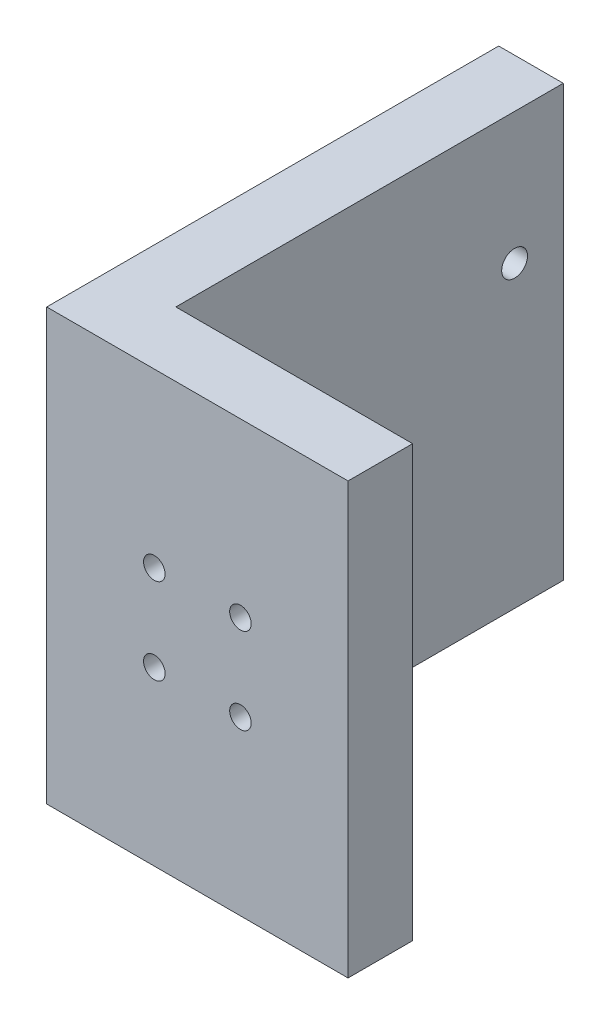
ISO-10303-21;
HEADER;
FILE_DESCRIPTION(('STEP AP214'),'2;1');
FILE_NAME('part.step','',(''),(''),'','','');
FILE_SCHEMA(('AUTOMOTIVE_DESIGN { 1 0 10303 214 1 1 1 1 }'));
ENDSEC;
DATA;
#1=APPLICATION_CONTEXT('core data for automotive mechanical design processes');
#2=APPLICATION_PROTOCOL_DEFINITION('international standard','automotive_design',2000,#1);
#3=PRODUCT_CONTEXT('',#1,'mechanical');
#4=PRODUCT('Part','Part','',(#3));
#5=PRODUCT_RELATED_PRODUCT_CATEGORY('part','',(#4));
#6=PRODUCT_DEFINITION_FORMATION('','',#4);
#7=PRODUCT_DEFINITION_CONTEXT('part definition',#1,'design');
#8=PRODUCT_DEFINITION('design','',#6,#7);
#9=PRODUCT_DEFINITION_SHAPE('','',#8);
#10=(LENGTH_UNIT() NAMED_UNIT(*) SI_UNIT(.MILLI.,.METRE.));
#11=(NAMED_UNIT(*) PLANE_ANGLE_UNIT() SI_UNIT($,.RADIAN.));
#12=(NAMED_UNIT(*) SI_UNIT($,.STERADIAN.) SOLID_ANGLE_UNIT());
#13=UNCERTAINTY_MEASURE_WITH_UNIT(LENGTH_MEASURE(1.E-05),#10,'distance_accuracy_value','');
#14=(GEOMETRIC_REPRESENTATION_CONTEXT(3) GLOBAL_UNCERTAINTY_ASSIGNED_CONTEXT((#13)) GLOBAL_UNIT_ASSIGNED_CONTEXT((#10,
#11,#12)) REPRESENTATION_CONTEXT('',''));
#15=CARTESIAN_POINT('',(0.,0.,0.));
#16=DIRECTION('',(0.,0.,1.));
#17=DIRECTION('',(1.,0.,0.));
#18=AXIS2_PLACEMENT_3D('',#15,#16,#17);
#19=CARTESIAN_POINT('',(0.,50.,0.));
#20=DIRECTION('',(0.,0.,-1.));
#21=DIRECTION('',(-1.,0.,0.));
#22=AXIS2_PLACEMENT_3D('',#19,#20,#21);
#23=PLANE('',#22);
#24=CARTESIAN_POINT('',(12.5,30.,0.));
#25=DIRECTION('',(0.,0.,1.));
#26=DIRECTION('',(1.,0.,0.));
#27=AXIS2_PLACEMENT_3D('',#24,#25,#26);
#28=CIRCLE('',#27,1.25);
#29=CARTESIAN_POINT('',(13.75,30.,0.));
#30=VERTEX_POINT('',#29);
#31=EDGE_CURVE('E147',#30,#30,#28,.T.);
#32=ORIENTED_EDGE('',*,*,#31,.F.);
#33=EDGE_LOOP('',(#32));
#34=FACE_BOUND('',#33,.T.);
#35=CARTESIAN_POINT('',(12.5,20.,0.));
#36=DIRECTION('',(0.,0.,1.));
#37=DIRECTION('',(1.,0.,0.));
#38=AXIS2_PLACEMENT_3D('',#35,#36,#37);
#39=CIRCLE('',#38,1.25);
#40=CARTESIAN_POINT('',(13.75,20.,0.));
#41=VERTEX_POINT('',#40);
#42=EDGE_CURVE('E143',#41,#41,#39,.T.);
#43=ORIENTED_EDGE('',*,*,#42,.F.);
#44=EDGE_LOOP('',(#43));
#45=FACE_BOUND('',#44,.T.);
#46=CARTESIAN_POINT('',(22.5,20.,0.));
#47=DIRECTION('',(0.,0.,1.));
#48=DIRECTION('',(1.,0.,0.));
#49=AXIS2_PLACEMENT_3D('',#46,#47,#48);
#50=CIRCLE('',#49,1.25);
#51=CARTESIAN_POINT('',(23.75,20.,0.));
#52=VERTEX_POINT('',#51);
#53=EDGE_CURVE('E140',#52,#52,#50,.T.);
#54=ORIENTED_EDGE('',*,*,#53,.F.);
#55=EDGE_LOOP('',(#54));
#56=FACE_BOUND('',#55,.T.);
#57=CARTESIAN_POINT('',(22.5,30.,0.));
#58=DIRECTION('',(0.,0.,1.));
#59=DIRECTION('',(1.,0.,0.));
#60=AXIS2_PLACEMENT_3D('',#57,#58,#59);
#61=CIRCLE('',#60,1.25);
#62=CARTESIAN_POINT('',(23.75,30.,0.));
#63=VERTEX_POINT('',#62);
#64=EDGE_CURVE('E113',#63,#63,#61,.T.);
#65=ORIENTED_EDGE('',*,*,#64,.F.);
#66=EDGE_LOOP('',(#65));
#67=FACE_BOUND('',#66,.T.);
#68=DIRECTION('',(1.,0.,0.));
#69=VECTOR('',#68,1.);
#70=CARTESIAN_POINT('',(0.,0.,0.));
#71=LINE('',#70,#69);
#72=CARTESIAN_POINT('',(0.,0.,0.));
#73=VERTEX_POINT('',#72);
#74=CARTESIAN_POINT('',(35.,0.,0.));
#75=VERTEX_POINT('',#74);
#76=EDGE_CURVE('E85',#73,#75,#71,.T.);
#77=ORIENTED_EDGE('',*,*,#76,.T.);
#78=DIRECTION('',(0.,-1.,0.));
#79=VECTOR('',#78,1.);
#80=CARTESIAN_POINT('',(35.,50.,0.));
#81=LINE('',#80,#79);
#82=CARTESIAN_POINT('',(35.,50.,0.));
#83=VERTEX_POINT('',#82);
#84=EDGE_CURVE('E45',#83,#75,#81,.T.);
#85=ORIENTED_EDGE('',*,*,#84,.F.);
#86=DIRECTION('',(1.,0.,0.));
#87=VECTOR('',#86,1.);
#88=CARTESIAN_POINT('',(0.,50.,0.));
#89=LINE('',#88,#87);
#90=CARTESIAN_POINT('',(0.,50.,0.));
#91=VERTEX_POINT('',#90);
#92=EDGE_CURVE('E88',#91,#83,#89,.T.);
#93=ORIENTED_EDGE('',*,*,#92,.F.);
#94=DIRECTION('',(0.,-1.,0.));
#95=VECTOR('',#94,1.);
#96=CARTESIAN_POINT('',(0.,50.,0.));
#97=LINE('',#96,#95);
#98=EDGE_CURVE('E157',#91,#73,#97,.T.);
#99=ORIENTED_EDGE('',*,*,#98,.T.);
#100=EDGE_LOOP('',(#77,#85,#93,#99));
#101=FACE_BOUND('',#100,.T.);
#102=ADVANCED_FACE('F35',(#34,#45,#56,#67,#101),#23,.F.);
#103=CARTESIAN_POINT('',(35.,50.,0.));
#104=DIRECTION('',(-1.,0.,0.));
#105=DIRECTION('',(0.,0.,1.));
#106=AXIS2_PLACEMENT_3D('',#103,#104,#105);
#107=PLANE('',#106);
#108=DIRECTION('',(0.,0.,-1.));
#109=VECTOR('',#108,1.);
#110=CARTESIAN_POINT('',(35.,0.,0.));
#111=LINE('',#110,#109);
#112=CARTESIAN_POINT('',(35.,0.,-7.5));
#113=VERTEX_POINT('',#112);
#114=EDGE_CURVE('E159',#75,#113,#111,.T.);
#115=ORIENTED_EDGE('',*,*,#114,.T.);
#116=DIRECTION('',(0.,-1.,0.));
#117=VECTOR('',#116,1.);
#118=CARTESIAN_POINT('',(35.,50.,-7.5));
#119=LINE('',#118,#117);
#120=CARTESIAN_POINT('',(35.,50.,-7.5));
#121=VERTEX_POINT('',#120);
#122=EDGE_CURVE('E166',#121,#113,#119,.T.);
#123=ORIENTED_EDGE('',*,*,#122,.F.);
#124=DIRECTION('',(0.,0.,-1.));
#125=VECTOR('',#124,1.);
#126=CARTESIAN_POINT('',(35.,50.,0.));
#127=LINE('',#126,#125);
#128=EDGE_CURVE('E151',#83,#121,#127,.T.);
#129=ORIENTED_EDGE('',*,*,#128,.F.);
#130=ORIENTED_EDGE('',*,*,#84,.T.);
#131=EDGE_LOOP('',(#115,#123,#129,#130));
#132=FACE_BOUND('',#131,.T.);
#133=ADVANCED_FACE('F124',(#132),#107,.F.);
#134=CARTESIAN_POINT('',(0.,50.,-7.5));
#135=DIRECTION('',(0.,0.,-1.));
#136=DIRECTION('',(-1.,0.,0.));
#137=AXIS2_PLACEMENT_3D('',#134,#135,#136);
#138=PLANE('',#137);
#139=CARTESIAN_POINT('',(12.5,30.,-7.5));
#140=DIRECTION('',(0.,0.,-1.));
#141=DIRECTION('',(-1.,0.,0.));
#142=AXIS2_PLACEMENT_3D('',#139,#140,#141);
#143=CIRCLE('',#142,1.25);
#144=CARTESIAN_POINT('',(11.25,30.,-7.5));
#145=VERTEX_POINT('',#144);
#146=EDGE_CURVE('E39',#145,#145,#143,.T.);
#147=ORIENTED_EDGE('',*,*,#146,.F.);
#148=EDGE_LOOP('',(#147));
#149=FACE_BOUND('',#148,.T.);
#150=CARTESIAN_POINT('',(12.5,20.,-7.5));
#151=DIRECTION('',(0.,0.,-1.));
#152=DIRECTION('',(-1.,0.,0.));
#153=AXIS2_PLACEMENT_3D('',#150,#151,#152);
#154=CIRCLE('',#153,1.25);
#155=CARTESIAN_POINT('',(11.25,20.,-7.5));
#156=VERTEX_POINT('',#155);
#157=EDGE_CURVE('E103',#156,#156,#154,.T.);
#158=ORIENTED_EDGE('',*,*,#157,.F.);
#159=EDGE_LOOP('',(#158));
#160=FACE_BOUND('',#159,.T.);
#161=CARTESIAN_POINT('',(22.5,20.,-7.5));
#162=DIRECTION('',(0.,0.,-1.));
#163=DIRECTION('',(-1.,0.,0.));
#164=AXIS2_PLACEMENT_3D('',#161,#162,#163);
#165=CIRCLE('',#164,1.25);
#166=CARTESIAN_POINT('',(21.25,20.,-7.5));
#167=VERTEX_POINT('',#166);
#168=EDGE_CURVE('E112',#167,#167,#165,.T.);
#169=ORIENTED_EDGE('',*,*,#168,.F.);
#170=EDGE_LOOP('',(#169));
#171=FACE_BOUND('',#170,.T.);
#172=CARTESIAN_POINT('',(22.5,30.,-7.5));
#173=DIRECTION('',(0.,0.,-1.));
#174=DIRECTION('',(-1.,0.,0.));
#175=AXIS2_PLACEMENT_3D('',#172,#173,#174);
#176=CIRCLE('',#175,1.25);
#177=CARTESIAN_POINT('',(21.25,30.,-7.5));
#178=VERTEX_POINT('',#177);
#179=EDGE_CURVE('E109',#178,#178,#176,.T.);
#180=ORIENTED_EDGE('',*,*,#179,.F.);
#181=EDGE_LOOP('',(#180));
#182=FACE_BOUND('',#181,.T.);
#183=DIRECTION('',(0.,-1.,0.));
#184=VECTOR('',#183,1.);
#185=CARTESIAN_POINT('',(7.5,50.,-7.5));
#186=LINE('',#185,#184);
#187=CARTESIAN_POINT('',(7.5,50.,-7.5));
#188=VERTEX_POINT('',#187);
#189=CARTESIAN_POINT('',(7.5,0.,-7.5));
#190=VERTEX_POINT('',#189);
#191=EDGE_CURVE('E11',#188,#190,#186,.T.);
#192=ORIENTED_EDGE('',*,*,#191,.F.);
#193=DIRECTION('',(1.,0.,0.));
#194=VECTOR('',#193,1.);
#195=CARTESIAN_POINT('',(0.,50.,-7.5));
#196=LINE('',#195,#194);
#197=EDGE_CURVE('E154',#188,#121,#196,.T.);
#198=ORIENTED_EDGE('',*,*,#197,.T.);
#199=ORIENTED_EDGE('',*,*,#122,.T.);
#200=DIRECTION('',(1.,0.,0.));
#201=VECTOR('',#200,1.);
#202=CARTESIAN_POINT('',(0.,0.,-7.5));
#203=LINE('',#202,#201);
#204=EDGE_CURVE('E89',#190,#113,#203,.T.);
#205=ORIENTED_EDGE('',*,*,#204,.F.);
#206=EDGE_LOOP('',(#192,#198,#199,#205));
#207=FACE_BOUND('',#206,.T.);
#208=ADVANCED_FACE('F121',(#149,#160,#171,#182,#207),#138,.T.);
#209=CARTESIAN_POINT('',(0.,50.,0.));
#210=DIRECTION('',(-1.,0.,0.));
#211=DIRECTION('',(0.,0.,1.));
#212=AXIS2_PLACEMENT_3D('',#209,#210,#211);
#213=PLANE('',#212);
#214=CARTESIAN_POINT('',(0.,5.55,-30.));
#215=DIRECTION('',(-1.,0.,0.));
#216=DIRECTION('',(0.,0.,1.));
#217=AXIS2_PLACEMENT_3D('',#214,#215,#216);
#218=CIRCLE('',#217,1.5);
#219=CARTESIAN_POINT('',(0.,5.55,-28.5));
#220=VERTEX_POINT('',#219);
#221=EDGE_CURVE('E216',#220,#220,#218,.F.);
#222=ORIENTED_EDGE('',*,*,#221,.T.);
#223=EDGE_LOOP('',(#222));
#224=FACE_BOUND('',#223,.T.);
#225=CARTESIAN_POINT('',(0.,34.725,-46.8441941036074));
#226=DIRECTION('',(-1.,0.,0.));
#227=DIRECTION('',(0.,0.,1.));
#228=AXIS2_PLACEMENT_3D('',#225,#226,#227);
#229=CIRCLE('',#228,1.50000000000001);
#230=CARTESIAN_POINT('',(0.,34.725,-45.3441941036074));
#231=VERTEX_POINT('',#230);
#232=EDGE_CURVE('E220',#231,#231,#229,.F.);
#233=ORIENTED_EDGE('',*,*,#232,.T.);
#234=EDGE_LOOP('',(#233));
#235=FACE_BOUND('',#234,.T.);
#236=CARTESIAN_POINT('',(0.,34.7250000000001,-13.1558058963927));
#237=DIRECTION('',(-1.,0.,0.));
#238=DIRECTION('',(0.,0.,1.));
#239=AXIS2_PLACEMENT_3D('',#236,#237,#238);
#240=CIRCLE('',#239,1.5);
#241=CARTESIAN_POINT('',(0.,34.7250000000001,-11.6558058963927));
#242=VERTEX_POINT('',#241);
#243=EDGE_CURVE('E223',#242,#242,#240,.F.);
#244=ORIENTED_EDGE('',*,*,#243,.T.);
#245=EDGE_LOOP('',(#244));
#246=FACE_BOUND('',#245,.T.);
#247=DIRECTION('',(0.,0.,-1.));
#248=VECTOR('',#247,1.);
#249=CARTESIAN_POINT('',(0.,0.,0.));
#250=LINE('',#249,#248);
#251=CARTESIAN_POINT('',(0.,0.,-52.5));
#252=VERTEX_POINT('',#251);
#253=EDGE_CURVE('E77',#73,#252,#250,.T.);
#254=ORIENTED_EDGE('',*,*,#253,.F.);
#255=ORIENTED_EDGE('',*,*,#98,.F.);
#256=DIRECTION('',(0.,0.,-1.));
#257=VECTOR('',#256,1.);
#258=CARTESIAN_POINT('',(0.,50.,0.));
#259=LINE('',#258,#257);
#260=CARTESIAN_POINT('',(0.,50.,-52.5));
#261=VERTEX_POINT('',#260);
#262=EDGE_CURVE('E95',#91,#261,#259,.T.);
#263=ORIENTED_EDGE('',*,*,#262,.T.);
#264=DIRECTION('',(0.,-1.,0.));
#265=VECTOR('',#264,1.);
#266=CARTESIAN_POINT('',(0.,50.,-52.5));
#267=LINE('',#266,#265);
#268=EDGE_CURVE('E92',#261,#252,#267,.T.);
#269=ORIENTED_EDGE('',*,*,#268,.T.);
#270=EDGE_LOOP('',(#254,#255,#263,#269));
#271=FACE_BOUND('',#270,.T.);
#272=ADVANCED_FACE('F93',(#224,#235,#246,#271),#213,.T.);
#273=CARTESIAN_POINT('',(0.,50.,0.));
#274=DIRECTION('',(0.,1.,0.));
#275=DIRECTION('',(0.,0.,1.));
#276=AXIS2_PLACEMENT_3D('',#273,#274,#275);
#277=PLANE('',#276);
#278=ORIENTED_EDGE('',*,*,#92,.T.);
#279=ORIENTED_EDGE('',*,*,#128,.T.);
#280=ORIENTED_EDGE('',*,*,#197,.F.);
#281=DIRECTION('',(0.,0.,-1.));
#282=VECTOR('',#281,1.);
#283=CARTESIAN_POINT('',(7.5,50.,-7.5));
#284=LINE('',#283,#282);
#285=CARTESIAN_POINT('',(7.5,50.,-52.5));
#286=VERTEX_POINT('',#285);
#287=EDGE_CURVE('E105',#188,#286,#284,.T.);
#288=ORIENTED_EDGE('',*,*,#287,.T.);
#289=DIRECTION('',(1.,0.,0.));
#290=VECTOR('',#289,1.);
#291=CARTESIAN_POINT('',(0.,50.,-52.5));
#292=LINE('',#291,#290);
#293=EDGE_CURVE('E100',#261,#286,#292,.T.);
#294=ORIENTED_EDGE('',*,*,#293,.F.);
#295=ORIENTED_EDGE('',*,*,#262,.F.);
#296=EDGE_LOOP('',(#278,#279,#280,#288,#294,#295));
#297=FACE_BOUND('',#296,.T.);
#298=ADVANCED_FACE('F172',(#297),#277,.T.);
#299=CARTESIAN_POINT('',(0.,0.,0.));
#300=DIRECTION('',(0.,1.,0.));
#301=DIRECTION('',(0.,0.,1.));
#302=AXIS2_PLACEMENT_3D('',#299,#300,#301);
#303=PLANE('',#302);
#304=ORIENTED_EDGE('',*,*,#76,.F.);
#305=ORIENTED_EDGE('',*,*,#253,.T.);
#306=DIRECTION('',(1.,0.,0.));
#307=VECTOR('',#306,1.);
#308=CARTESIAN_POINT('',(0.,0.,-52.5));
#309=LINE('',#308,#307);
#310=CARTESIAN_POINT('',(7.5,0.,-52.5));
#311=VERTEX_POINT('',#310);
#312=EDGE_CURVE('E81',#252,#311,#309,.T.);
#313=ORIENTED_EDGE('',*,*,#312,.T.);
#314=DIRECTION('',(0.,0.,-1.));
#315=VECTOR('',#314,1.);
#316=CARTESIAN_POINT('',(7.5,0.,-7.5));
#317=LINE('',#316,#315);
#318=EDGE_CURVE('E98',#190,#311,#317,.T.);
#319=ORIENTED_EDGE('',*,*,#318,.F.);
#320=ORIENTED_EDGE('',*,*,#204,.T.);
#321=ORIENTED_EDGE('',*,*,#114,.F.);
#322=EDGE_LOOP('',(#304,#305,#313,#319,#320,#321));
#323=FACE_BOUND('',#322,.T.);
#324=ADVANCED_FACE('F79',(#323),#303,.F.);
#325=CARTESIAN_POINT('',(0.,50.,-52.5));
#326=DIRECTION('',(0.,0.,-1.));
#327=DIRECTION('',(-1.,0.,0.));
#328=AXIS2_PLACEMENT_3D('',#325,#326,#327);
#329=PLANE('',#328);
#330=ORIENTED_EDGE('',*,*,#312,.F.);
#331=ORIENTED_EDGE('',*,*,#268,.F.);
#332=ORIENTED_EDGE('',*,*,#293,.T.);
#333=DIRECTION('',(0.,-1.,0.));
#334=VECTOR('',#333,1.);
#335=CARTESIAN_POINT('',(7.5,50.,-52.5));
#336=LINE('',#335,#334);
#337=EDGE_CURVE('E70',#286,#311,#336,.T.);
#338=ORIENTED_EDGE('',*,*,#337,.T.);
#339=EDGE_LOOP('',(#330,#331,#332,#338));
#340=FACE_BOUND('',#339,.T.);
#341=ADVANCED_FACE('F37',(#340),#329,.T.);
#342=CARTESIAN_POINT('',(7.5,50.,-7.5));
#343=DIRECTION('',(-1.,0.,0.));
#344=DIRECTION('',(0.,0.,1.));
#345=AXIS2_PLACEMENT_3D('',#342,#343,#344);
#346=PLANE('',#345);
#347=CARTESIAN_POINT('',(7.5,5.55,-30.));
#348=DIRECTION('',(1.,0.,0.));
#349=DIRECTION('',(0.,0.,-1.));
#350=AXIS2_PLACEMENT_3D('',#347,#348,#349);
#351=CIRCLE('',#350,1.5);
#352=CARTESIAN_POINT('',(7.5,5.55,-31.5));
#353=VERTEX_POINT('',#352);
#354=EDGE_CURVE('E225',#353,#353,#351,.F.);
#355=ORIENTED_EDGE('',*,*,#354,.T.);
#356=EDGE_LOOP('',(#355));
#357=FACE_BOUND('',#356,.T.);
#358=CARTESIAN_POINT('',(7.5,34.725,-46.8441941036074));
#359=DIRECTION('',(-1.,0.,0.));
#360=DIRECTION('',(0.,0.,1.));
#361=AXIS2_PLACEMENT_3D('',#358,#359,#360);
#362=CIRCLE('',#361,1.50000000000001);
#363=CARTESIAN_POINT('',(7.5,34.725,-45.3441941036074));
#364=VERTEX_POINT('',#363);
#365=EDGE_CURVE('E229',#364,#364,#362,.T.);
#366=ORIENTED_EDGE('',*,*,#365,.T.);
#367=EDGE_LOOP('',(#366));
#368=FACE_BOUND('',#367,.T.);
#369=CARTESIAN_POINT('',(7.5,34.7250000000001,-13.1558058963927));
#370=DIRECTION('',(-1.,0.,0.));
#371=DIRECTION('',(0.,0.,1.));
#372=AXIS2_PLACEMENT_3D('',#369,#370,#371);
#373=CIRCLE('',#372,1.5);
#374=CARTESIAN_POINT('',(7.5,34.7250000000001,-11.6558058963927));
#375=VERTEX_POINT('',#374);
#376=EDGE_CURVE('E232',#375,#375,#373,.T.);
#377=ORIENTED_EDGE('',*,*,#376,.T.);
#378=EDGE_LOOP('',(#377));
#379=FACE_BOUND('',#378,.T.);
#380=ORIENTED_EDGE('',*,*,#318,.T.);
#381=ORIENTED_EDGE('',*,*,#337,.F.);
#382=ORIENTED_EDGE('',*,*,#287,.F.);
#383=ORIENTED_EDGE('',*,*,#191,.T.);
#384=EDGE_LOOP('',(#380,#381,#382,#383));
#385=FACE_BOUND('',#384,.T.);
#386=ADVANCED_FACE('F135',(#357,#368,#379,#385),#346,.F.);
#387=CARTESIAN_POINT('',(22.5,30.,-37.5));
#388=DIRECTION('',(0.,0.,1.));
#389=DIRECTION('',(1.,0.,0.));
#390=AXIS2_PLACEMENT_3D('',#387,#388,#389);
#391=CYLINDRICAL_SURFACE('',#390,1.25);
#392=ORIENTED_EDGE('',*,*,#179,.T.);
#393=EDGE_LOOP('',(#392));
#394=FACE_BOUND('',#393,.T.);
#395=ORIENTED_EDGE('',*,*,#64,.T.);
#396=EDGE_LOOP('',(#395));
#397=FACE_BOUND('',#396,.T.);
#398=ADVANCED_FACE('F131',(#394,#397),#391,.F.);
#399=CARTESIAN_POINT('',(22.5,20.,-37.5));
#400=DIRECTION('',(0.,0.,1.));
#401=DIRECTION('',(1.,0.,0.));
#402=AXIS2_PLACEMENT_3D('',#399,#400,#401);
#403=CYLINDRICAL_SURFACE('',#402,1.25);
#404=ORIENTED_EDGE('',*,*,#168,.T.);
#405=EDGE_LOOP('',(#404));
#406=FACE_BOUND('',#405,.T.);
#407=ORIENTED_EDGE('',*,*,#53,.T.);
#408=EDGE_LOOP('',(#407));
#409=FACE_BOUND('',#408,.T.);
#410=ADVANCED_FACE('F134',(#406,#409),#403,.F.);
#411=CARTESIAN_POINT('',(12.5,20.,-37.5));
#412=DIRECTION('',(0.,0.,1.));
#413=DIRECTION('',(1.,0.,0.));
#414=AXIS2_PLACEMENT_3D('',#411,#412,#413);
#415=CYLINDRICAL_SURFACE('',#414,1.25);
#416=ORIENTED_EDGE('',*,*,#157,.T.);
#417=EDGE_LOOP('',(#416));
#418=FACE_BOUND('',#417,.T.);
#419=ORIENTED_EDGE('',*,*,#42,.T.);
#420=EDGE_LOOP('',(#419));
#421=FACE_BOUND('',#420,.T.);
#422=ADVANCED_FACE('F118',(#418,#421),#415,.F.);
#423=CARTESIAN_POINT('',(12.5,30.,-37.5));
#424=DIRECTION('',(0.,0.,1.));
#425=DIRECTION('',(1.,0.,0.));
#426=AXIS2_PLACEMENT_3D('',#423,#424,#425);
#427=CYLINDRICAL_SURFACE('',#426,1.25);
#428=ORIENTED_EDGE('',*,*,#146,.T.);
#429=EDGE_LOOP('',(#428));
#430=FACE_BOUND('',#429,.T.);
#431=ORIENTED_EDGE('',*,*,#31,.T.);
#432=EDGE_LOOP('',(#431));
#433=FACE_BOUND('',#432,.T.);
#434=ADVANCED_FACE('F239',(#430,#433),#427,.F.);
#435=CARTESIAN_POINT('',(-6.,34.7250000000001,-13.1558058963927));
#436=DIRECTION('',(1.,0.,0.));
#437=DIRECTION('',(0.,0.,-1.));
#438=AXIS2_PLACEMENT_3D('',#435,#436,#437);
#439=CYLINDRICAL_SURFACE('',#438,1.5);
#440=ORIENTED_EDGE('',*,*,#243,.F.);
#441=EDGE_LOOP('',(#440));
#442=FACE_BOUND('',#441,.T.);
#443=ORIENTED_EDGE('',*,*,#376,.F.);
#444=EDGE_LOOP('',(#443));
#445=FACE_BOUND('',#444,.T.);
#446=ADVANCED_FACE('F241',(#442,#445),#439,.F.);
#447=CARTESIAN_POINT('',(-6.,34.725,-46.8441941036074));
#448=DIRECTION('',(1.,0.,0.));
#449=DIRECTION('',(0.,0.,-1.));
#450=AXIS2_PLACEMENT_3D('',#447,#448,#449);
#451=CYLINDRICAL_SURFACE('',#450,1.50000000000001);
#452=ORIENTED_EDGE('',*,*,#232,.F.);
#453=EDGE_LOOP('',(#452));
#454=FACE_BOUND('',#453,.T.);
#455=ORIENTED_EDGE('',*,*,#365,.F.);
#456=EDGE_LOOP('',(#455));
#457=FACE_BOUND('',#456,.T.);
#458=ADVANCED_FACE('F248',(#454,#457),#451,.F.);
#459=CARTESIAN_POINT('',(-6.,5.55,-30.));
#460=DIRECTION('',(1.,0.,0.));
#461=DIRECTION('',(0.,0.,-1.));
#462=AXIS2_PLACEMENT_3D('',#459,#460,#461);
#463=CYLINDRICAL_SURFACE('',#462,1.5);
#464=ORIENTED_EDGE('',*,*,#221,.F.);
#465=EDGE_LOOP('',(#464));
#466=FACE_BOUND('',#465,.T.);
#467=ORIENTED_EDGE('',*,*,#354,.F.);
#468=EDGE_LOOP('',(#467));
#469=FACE_BOUND('',#468,.T.);
#470=ADVANCED_FACE('F257',(#466,#469),#463,.F.);
#471=CLOSED_SHELL('',(#102,#133,#208,#272,#298,#324,#341,#386,#398,#410,#422,#434,#446,#458,#470));
#472=MANIFOLD_SOLID_BREP('B2',#471);
#473=ADVANCED_BREP_SHAPE_REPRESENTATION('',(#18,#472),#14);
#474=SHAPE_DEFINITION_REPRESENTATION(#9,#473);
ENDSEC;
END-ISO-10303-21;
